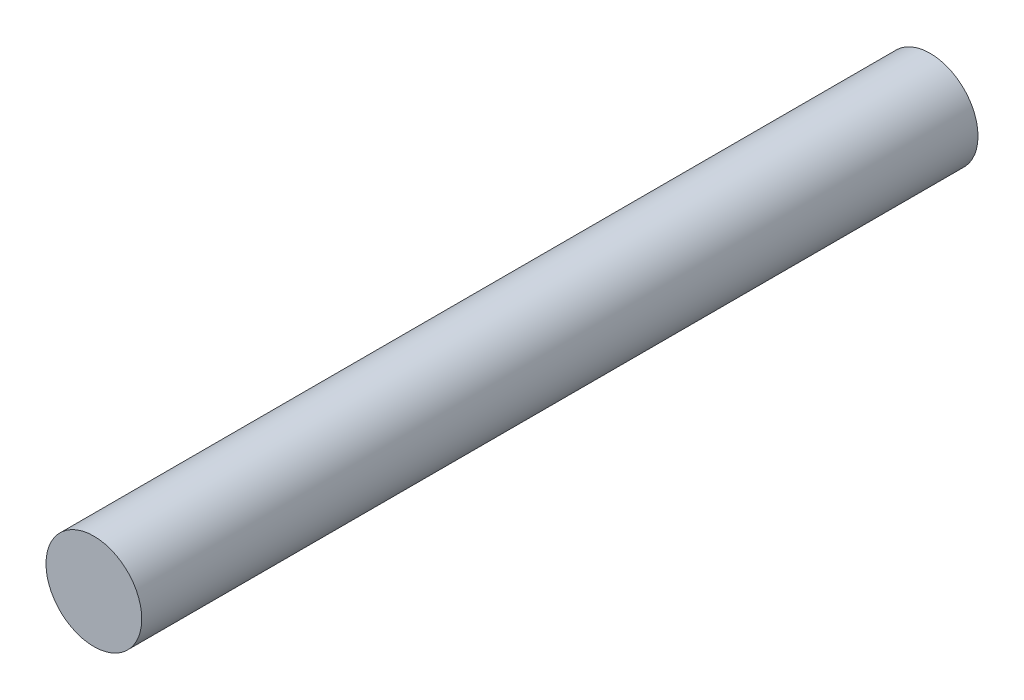
ISO-10303-21;
HEADER;
FILE_DESCRIPTION(('STEP AP214'),'2;1');
FILE_NAME('part.step','',(''),(''),'','','');
FILE_SCHEMA(('AUTOMOTIVE_DESIGN { 1 0 10303 214 1 1 1 1 }'));
ENDSEC;
DATA;
#1=APPLICATION_CONTEXT('core data for automotive mechanical design processes');
#2=APPLICATION_PROTOCOL_DEFINITION('international standard','automotive_design',2000,#1);
#3=PRODUCT_CONTEXT('',#1,'mechanical');
#4=PRODUCT('Part','Part','',(#3));
#5=PRODUCT_RELATED_PRODUCT_CATEGORY('part','',(#4));
#6=PRODUCT_DEFINITION_FORMATION('','',#4);
#7=PRODUCT_DEFINITION_CONTEXT('part definition',#1,'design');
#8=PRODUCT_DEFINITION('design','',#6,#7);
#9=PRODUCT_DEFINITION_SHAPE('','',#8);
#10=(LENGTH_UNIT() NAMED_UNIT(*) SI_UNIT(.MILLI.,.METRE.));
#11=(NAMED_UNIT(*) PLANE_ANGLE_UNIT() SI_UNIT($,.RADIAN.));
#12=(NAMED_UNIT(*) SI_UNIT($,.STERADIAN.) SOLID_ANGLE_UNIT());
#13=UNCERTAINTY_MEASURE_WITH_UNIT(LENGTH_MEASURE(1.E-05),#10,'distance_accuracy_value','');
#14=(GEOMETRIC_REPRESENTATION_CONTEXT(3) GLOBAL_UNCERTAINTY_ASSIGNED_CONTEXT((#13)) GLOBAL_UNIT_ASSIGNED_CONTEXT((#10,
#11,#12)) REPRESENTATION_CONTEXT('',''));
#15=CARTESIAN_POINT('',(0.,0.,0.));
#16=DIRECTION('',(0.,0.,1.));
#17=DIRECTION('',(1.,0.,0.));
#18=AXIS2_PLACEMENT_3D('',#15,#16,#17);
#19=CARTESIAN_POINT('',(0.,0.,13.9754248593737));
#20=DIRECTION('',(0.,0.,1.));
#21=DIRECTION('',(1.,0.,0.));
#22=AXIS2_PLACEMENT_3D('',#19,#20,#21);
#23=PLANE('',#22);
#24=CARTESIAN_POINT('',(0.,0.,13.9754248593737));
#25=DIRECTION('',(0.,0.,-1.));
#26=DIRECTION('',(-1.,0.,0.));
#27=AXIS2_PLACEMENT_3D('',#24,#25,#26);
#28=CIRCLE('',#27,1.6);
#29=CARTESIAN_POINT('',(-1.6,0.,13.9754248593737));
#30=VERTEX_POINT('',#29);
#31=EDGE_CURVE('E9',#30,#30,#28,.T.);
#32=ORIENTED_EDGE('',*,*,#31,.F.);
#33=EDGE_LOOP('',(#32));
#34=FACE_BOUND('',#33,.T.);
#35=ADVANCED_FACE('F14',(#34),#23,.T.);
#36=CARTESIAN_POINT('',(0.,0.,-13.9754248593737));
#37=DIRECTION('',(0.,0.,-1.));
#38=DIRECTION('',(-1.,0.,0.));
#39=AXIS2_PLACEMENT_3D('',#36,#37,#38);
#40=PLANE('',#39);
#41=CARTESIAN_POINT('',(0.,0.,-13.9754248593737));
#42=DIRECTION('',(0.,0.,1.));
#43=DIRECTION('',(1.,0.,0.));
#44=AXIS2_PLACEMENT_3D('',#41,#42,#43);
#45=CIRCLE('',#44,1.6);
#46=CARTESIAN_POINT('',(1.6,0.,-13.9754248593737));
#47=VERTEX_POINT('',#46);
#48=EDGE_CURVE('E21',#47,#47,#45,.T.);
#49=ORIENTED_EDGE('',*,*,#48,.F.);
#50=EDGE_LOOP('',(#49));
#51=FACE_BOUND('',#50,.T.);
#52=ADVANCED_FACE('F29',(#51),#40,.T.);
#53=CARTESIAN_POINT('',(0.,0.,-13.9754248593737));
#54=DIRECTION('',(0.,0.,1.));
#55=DIRECTION('',(1.,0.,0.));
#56=AXIS2_PLACEMENT_3D('',#53,#54,#55);
#57=CYLINDRICAL_SURFACE('',#56,1.6);
#58=ORIENTED_EDGE('',*,*,#31,.T.);
#59=EDGE_LOOP('',(#58));
#60=FACE_BOUND('',#59,.T.);
#61=ORIENTED_EDGE('',*,*,#48,.T.);
#62=EDGE_LOOP('',(#61));
#63=FACE_BOUND('',#62,.T.);
#64=ADVANCED_FACE('F16',(#60,#63),#57,.T.);
#65=CLOSED_SHELL('',(#35,#52,#64));
#66=MANIFOLD_SOLID_BREP('B1',#65);
#67=ADVANCED_BREP_SHAPE_REPRESENTATION('',(#18,#66),#14);
#68=SHAPE_DEFINITION_REPRESENTATION(#9,#67);
ENDSEC;
END-ISO-10303-21;
